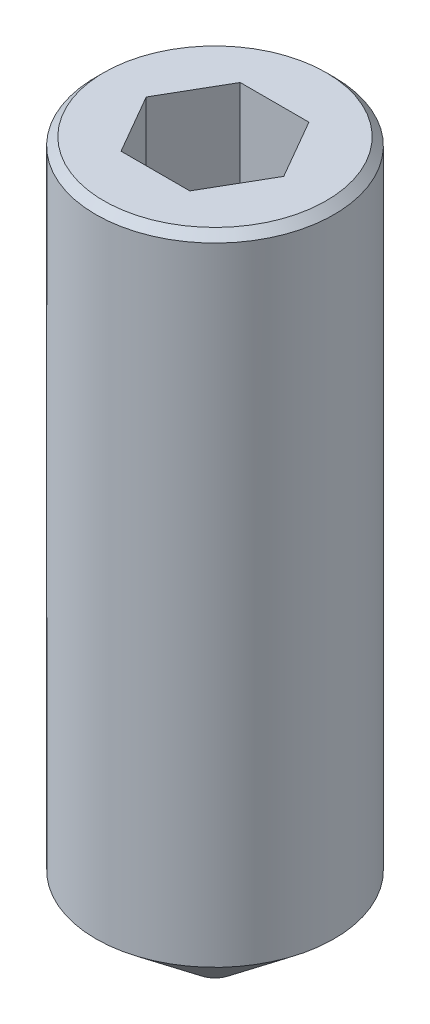
ISO-10303-21;
HEADER;
FILE_DESCRIPTION(('STEP AP214'),'2;1');
FILE_NAME('part.step','',(''),(''),'','','');
FILE_SCHEMA(('AUTOMOTIVE_DESIGN { 1 0 10303 214 1 1 1 1 }'));
ENDSEC;
DATA;
#1=APPLICATION_CONTEXT('core data for automotive mechanical design processes');
#2=APPLICATION_PROTOCOL_DEFINITION('international standard','automotive_design',2000,#1);
#3=PRODUCT_CONTEXT('',#1,'mechanical');
#4=PRODUCT('Part','Part','',(#3));
#5=PRODUCT_RELATED_PRODUCT_CATEGORY('part','',(#4));
#6=PRODUCT_DEFINITION_FORMATION('','',#4);
#7=PRODUCT_DEFINITION_CONTEXT('part definition',#1,'design');
#8=PRODUCT_DEFINITION('design','',#6,#7);
#9=PRODUCT_DEFINITION_SHAPE('','',#8);
#10=(LENGTH_UNIT() NAMED_UNIT(*) SI_UNIT(.MILLI.,.METRE.));
#11=(NAMED_UNIT(*) PLANE_ANGLE_UNIT() SI_UNIT($,.RADIAN.));
#12=(NAMED_UNIT(*) SI_UNIT($,.STERADIAN.) SOLID_ANGLE_UNIT());
#13=UNCERTAINTY_MEASURE_WITH_UNIT(LENGTH_MEASURE(1.E-05),#10,'distance_accuracy_value','');
#14=(GEOMETRIC_REPRESENTATION_CONTEXT(3) GLOBAL_UNCERTAINTY_ASSIGNED_CONTEXT((#13)) GLOBAL_UNIT_ASSIGNED_CONTEXT((#10,
#11,#12)) REPRESENTATION_CONTEXT('',''));
#15=CARTESIAN_POINT('',(0.,0.,0.));
#16=DIRECTION('',(0.,0.,1.));
#17=DIRECTION('',(1.,0.,0.));
#18=AXIS2_PLACEMENT_3D('',#15,#16,#17);
#19=CARTESIAN_POINT('',(0.,0.,0.));
#20=DIRECTION('',(0.,-1.,0.));
#21=DIRECTION('',(0.,0.,-1.));
#22=AXIS2_PLACEMENT_3D('',#19,#20,#21);
#23=PLANE('',#22);
#24=CARTESIAN_POINT('',(0.,0.,0.));
#25=DIRECTION('',(0.,-1.,0.));
#26=DIRECTION('',(0.,0.,-1.));
#27=AXIS2_PLACEMENT_3D('',#24,#25,#26);
#28=CIRCLE('',#27,1.4);
#29=CARTESIAN_POINT('',(0.,0.,-1.4));
#30=VERTEX_POINT('',#29);
#31=EDGE_CURVE('E43',#30,#30,#28,.F.);
#32=ORIENTED_EDGE('',*,*,#31,.T.);
#33=EDGE_LOOP('',(#32));
#34=FACE_BOUND('',#33,.T.);
#35=DIRECTION('',(1.,0.,0.));
#36=VECTOR('',#35,1.);
#37=CARTESIAN_POINT('',(-0.433012701892219,0.,0.75));
#38=LINE('',#37,#36);
#39=CARTESIAN_POINT('',(-0.433012701892219,0.,0.75));
#40=VERTEX_POINT('',#39);
#41=CARTESIAN_POINT('',(0.433012701892219,0.,0.75));
#42=VERTEX_POINT('',#41);
#43=EDGE_CURVE('E124',#40,#42,#38,.T.);
#44=ORIENTED_EDGE('',*,*,#43,.F.);
#45=DIRECTION('',(0.5,0.,0.866025403784438));
#46=VECTOR('',#45,1.);
#47=CARTESIAN_POINT('',(-0.866025403784439,0.,0.));
#48=LINE('',#47,#46);
#49=CARTESIAN_POINT('',(-0.866025403784439,0.,0.));
#50=VERTEX_POINT('',#49);
#51=EDGE_CURVE('E50',#50,#40,#48,.T.);
#52=ORIENTED_EDGE('',*,*,#51,.F.);
#53=DIRECTION('',(-0.5,0.,0.866025403784439));
#54=VECTOR('',#53,1.);
#55=CARTESIAN_POINT('',(-0.433012701892219,0.,-0.75));
#56=LINE('',#55,#54);
#57=CARTESIAN_POINT('',(-0.433012701892219,0.,-0.75));
#58=VERTEX_POINT('',#57);
#59=EDGE_CURVE('E133',#58,#50,#56,.T.);
#60=ORIENTED_EDGE('',*,*,#59,.F.);
#61=DIRECTION('',(-1.,0.,0.));
#62=VECTOR('',#61,1.);
#63=CARTESIAN_POINT('',(0.433012701892219,0.,-0.75));
#64=LINE('',#63,#62);
#65=CARTESIAN_POINT('',(0.433012701892219,0.,-0.75));
#66=VERTEX_POINT('',#65);
#67=EDGE_CURVE('E131',#66,#58,#64,.T.);
#68=ORIENTED_EDGE('',*,*,#67,.F.);
#69=DIRECTION('',(-0.5,0.,-0.866025403784439));
#70=VECTOR('',#69,1.);
#71=CARTESIAN_POINT('',(0.866025403784438,0.,0.));
#72=LINE('',#71,#70);
#73=CARTESIAN_POINT('',(0.866025403784438,0.,0.));
#74=VERTEX_POINT('',#73);
#75=EDGE_CURVE('E98',#74,#66,#72,.T.);
#76=ORIENTED_EDGE('',*,*,#75,.F.);
#77=DIRECTION('',(0.5,0.,-0.866025403784439));
#78=VECTOR('',#77,1.);
#79=CARTESIAN_POINT('',(0.433012701892219,0.,0.75));
#80=LINE('',#79,#78);
#81=EDGE_CURVE('E127',#42,#74,#80,.T.);
#82=ORIENTED_EDGE('',*,*,#81,.F.);
#83=EDGE_LOOP('',(#44,#52,#60,#68,#76,#82));
#84=FACE_BOUND('',#83,.T.);
#85=ADVANCED_FACE('F35',(#34,#84),#23,.F.);
#86=CARTESIAN_POINT('',(0.,8.71350028878554,0.));
#87=DIRECTION('',(0.,1.,0.));
#88=DIRECTION('',(0.,0.,1.));
#89=AXIS2_PLACEMENT_3D('',#86,#87,#88);
#90=CYLINDRICAL_SURFACE('',#89,1.5);
#91=CARTESIAN_POINT('',(0.,-0.0999999999999994,0.));
#92=DIRECTION('',(0.,-1.,0.));
#93=DIRECTION('',(0.,0.,-1.));
#94=AXIS2_PLACEMENT_3D('',#91,#92,#93);
#95=CIRCLE('',#94,1.5);
#96=CARTESIAN_POINT('',(0.,-0.0999999999999994,-1.5));
#97=VERTEX_POINT('',#96);
#98=EDGE_CURVE('E11',#97,#97,#95,.T.);
#99=ORIENTED_EDGE('',*,*,#98,.T.);
#100=EDGE_LOOP('',(#99));
#101=FACE_BOUND('',#100,.T.);
#102=CARTESIAN_POINT('',(0.,-8.,0.));
#103=DIRECTION('',(0.,1.,0.));
#104=DIRECTION('',(0.,0.,1.));
#105=AXIS2_PLACEMENT_3D('',#102,#103,#104);
#106=CIRCLE('',#105,1.5);
#107=CARTESIAN_POINT('',(0.,-8.,1.5));
#108=VERTEX_POINT('',#107);
#109=EDGE_CURVE('E145',#108,#108,#106,.T.);
#110=ORIENTED_EDGE('',*,*,#109,.T.);
#111=EDGE_LOOP('',(#110));
#112=FACE_BOUND('',#111,.T.);
#113=ADVANCED_FACE('F161',(#101,#112),#90,.T.);
#114=CARTESIAN_POINT('',(0.,-9.,0.));
#115=DIRECTION('',(0.,1.,0.));
#116=DIRECTION('',(0.,0.,1.));
#117=AXIS2_PLACEMENT_3D('',#114,#115,#116);
#118=CONICAL_SURFACE('',#117,0.250000000000002,0.896055384571344);
#119=CARTESIAN_POINT('',(0.,-9.,0.));
#120=DIRECTION('',(0.,1.,0.));
#121=DIRECTION('',(0.,0.,1.));
#122=AXIS2_PLACEMENT_3D('',#119,#120,#121);
#123=CIRCLE('',#122,0.250000000000002);
#124=CARTESIAN_POINT('',(0.,-9.,0.250000000000001));
#125=VERTEX_POINT('',#124);
#126=EDGE_CURVE('E137',#125,#125,#123,.T.);
#127=CARTESIAN_POINT('',(0.,-8.,1.5));
#128=CARTESIAN_POINT('',(0.,-8.01041666666667,1.48697916666667));
#129=CARTESIAN_POINT('',(0.,-8.02083333333333,1.47395833333333));
#130=CARTESIAN_POINT('',(0.,-8.04166666666667,1.44791666666667));
#131=CARTESIAN_POINT('',(0.,-8.05208333333333,1.43489583333333));
#132=CARTESIAN_POINT('',(0.,-8.07291666666667,1.40885416666667));
#133=CARTESIAN_POINT('',(0.,-8.08333333333333,1.39583333333333));
#134=CARTESIAN_POINT('',(0.,-8.10416666666667,1.36979166666667));
#135=CARTESIAN_POINT('',(0.,-8.11458333333333,1.35677083333333));
#136=CARTESIAN_POINT('',(0.,-8.13541666666667,1.33072916666667));
#137=CARTESIAN_POINT('',(0.,-8.14583333333333,1.31770833333333));
#138=CARTESIAN_POINT('',(0.,-8.16666666666667,1.29166666666667));
#139=CARTESIAN_POINT('',(0.,-8.17708333333333,1.27864583333333));
#140=CARTESIAN_POINT('',(0.,-8.19791666666667,1.25260416666667));
#141=CARTESIAN_POINT('',(0.,-8.20833333333333,1.23958333333333));
#142=CARTESIAN_POINT('',(0.,-8.22916666666667,1.21354166666667));
#143=CARTESIAN_POINT('',(0.,-8.23958333333333,1.20052083333333));
#144=CARTESIAN_POINT('',(0.,-8.26041666666667,1.17447916666667));
#145=CARTESIAN_POINT('',(0.,-8.27083333333333,1.16145833333333));
#146=CARTESIAN_POINT('',(0.,-8.29166666666667,1.13541666666667));
#147=CARTESIAN_POINT('',(0.,-8.30208333333333,1.12239583333333));
#148=CARTESIAN_POINT('',(0.,-8.32291666666667,1.09635416666667));
#149=CARTESIAN_POINT('',(0.,-8.33333333333333,1.08333333333333));
#150=CARTESIAN_POINT('',(0.,-8.35416666666667,1.05729166666667));
#151=CARTESIAN_POINT('',(0.,-8.36458333333333,1.04427083333333));
#152=CARTESIAN_POINT('',(0.,-8.38541666666667,1.01822916666667));
#153=CARTESIAN_POINT('',(0.,-8.39583333333333,1.00520833333333));
#154=CARTESIAN_POINT('',(0.,-8.41666666666667,0.979166666666668));
#155=CARTESIAN_POINT('',(0.,-8.42708333333333,0.966145833333335));
#156=CARTESIAN_POINT('',(0.,-8.44791666666667,0.940104166666668));
#157=CARTESIAN_POINT('',(0.,-8.45833333333333,0.927083333333335));
#158=CARTESIAN_POINT('',(0.,-8.47916666666667,0.901041666666668));
#159=CARTESIAN_POINT('',(0.,-8.48958333333333,0.888020833333334));
#160=CARTESIAN_POINT('',(0.,-8.51041666666667,0.861979166666668));
#161=CARTESIAN_POINT('',(0.,-8.52083333333333,0.848958333333334));
#162=CARTESIAN_POINT('',(0.,-8.54166666666667,0.822916666666668));
#163=CARTESIAN_POINT('',(0.,-8.55208333333333,0.809895833333334));
#164=CARTESIAN_POINT('',(0.,-8.57291666666667,0.783854166666668));
#165=CARTESIAN_POINT('',(0.,-8.58333333333333,0.770833333333334));
#166=CARTESIAN_POINT('',(0.,-8.60416666666667,0.744791666666668));
#167=CARTESIAN_POINT('',(0.,-8.61458333333333,0.731770833333334));
#168=CARTESIAN_POINT('',(0.,-8.63541666666667,0.705729166666668));
#169=CARTESIAN_POINT('',(0.,-8.64583333333333,0.692708333333334));
#170=CARTESIAN_POINT('',(0.,-8.66666666666667,0.666666666666668));
#171=CARTESIAN_POINT('',(0.,-8.67708333333333,0.653645833333334));
#172=CARTESIAN_POINT('',(0.,-8.69791666666667,0.627604166666668));
#173=CARTESIAN_POINT('',(0.,-8.70833333333333,0.614583333333334));
#174=CARTESIAN_POINT('',(0.,-8.72916666666667,0.588541666666668));
#175=CARTESIAN_POINT('',(0.,-8.73958333333333,0.575520833333334));
#176=CARTESIAN_POINT('',(0.,-8.76041666666667,0.549479166666668));
#177=CARTESIAN_POINT('',(0.,-8.77083333333333,0.536458333333334));
#178=CARTESIAN_POINT('',(0.,-8.79166666666667,0.510416666666668));
#179=CARTESIAN_POINT('',(0.,-8.80208333333333,0.497395833333334));
#180=CARTESIAN_POINT('',(0.,-8.82291666666667,0.471354166666668));
#181=CARTESIAN_POINT('',(0.,-8.83333333333333,0.458333333333334));
#182=CARTESIAN_POINT('',(0.,-8.85416666666667,0.432291666666668));
#183=CARTESIAN_POINT('',(0.,-8.86458333333333,0.419270833333334));
#184=CARTESIAN_POINT('',(0.,-8.88541666666667,0.393229166666668));
#185=CARTESIAN_POINT('',(0.,-8.89583333333333,0.380208333333334));
#186=CARTESIAN_POINT('',(0.,-8.91666666666667,0.354166666666668));
#187=CARTESIAN_POINT('',(0.,-8.92708333333333,0.341145833333334));
#188=CARTESIAN_POINT('',(0.,-8.94791666666667,0.315104166666668));
#189=CARTESIAN_POINT('',(0.,-8.95833333333333,0.302083333333334));
#190=CARTESIAN_POINT('',(0.,-8.97916666666667,0.276041666666668));
#191=CARTESIAN_POINT('',(0.,-8.98958333333333,0.263020833333334));
#192=CARTESIAN_POINT('',(0.,-9.,0.250000000000001));
#193=B_SPLINE_CURVE_WITH_KNOTS('',3,(#127,#128,#129,#130,#131,#132,#133,#134,#135,#136,#137,
#138,#139,#140,#141,#142,#143,#144,#145,#146,#147,#148,#149,#150,#151,#152,#153,#154,#155,#156,
#157,#158,#159,#160,#161,#162,#163,#164,#165,#166,#167,#168,#169,#170,#171,#172,#173,#174,#175,
#176,#177,#178,#179,#180,#181,#182,#183,#184,#185,#186,#187,#188,#189,#190,#191,#192),
.UNSPECIFIED.,.F.,.F.,(4,2,2,2,2,2,2,2,2,2,2,2,2,2,2,2,2,2,2,2,2,2,2,2,2,2,2,2,2,2,2,2,4),(0.,
0.0500244081049442,0.100048816209888,0.150073224314833,0.200097632419777,0.250122040524721,
0.300146448629665,0.350170856734609,0.400195264839553,0.450219672944497,0.500244081049442,
0.550268489154386,0.60029289725933,0.650317305364274,0.700341713469218,0.750366121574162,
0.800390529679107,0.850414937784051,0.900439345888995,0.950463753993939,1.00048816209888,
1.05051257020383,1.10053697830877,1.15056138641372,1.20058579451866,1.2506102026236,
1.30063461072855,1.35065901883349,1.40068342693844,1.45070783504338,1.50073224314833,
1.55075665125327,1.60078105935821),.UNSPECIFIED.);
#194=EDGE_CURVE('BSEAM165',#108,#125,#193,.T.);
#195=ORIENTED_EDGE('',*,*,#109,.F.);
#196=ORIENTED_EDGE('',*,*,#126,.T.);
#197=ORIENTED_EDGE('',*,*,#194,.T.);
#198=ORIENTED_EDGE('',*,*,#194,.F.);
#199=EDGE_LOOP('',(#195,#197,#196,#198));
#200=FACE_BOUND('',#199,.T.);
#201=ADVANCED_FACE('F165',(#200),#118,.T.);
#202=CARTESIAN_POINT('',(0.250000000000002,-9.,0.));
#203=DIRECTION('',(0.,1.,0.));
#204=DIRECTION('',(0.,0.,1.));
#205=AXIS2_PLACEMENT_3D('',#202,#203,#204);
#206=PLANE('',#205);
#207=ORIENTED_EDGE('',*,*,#126,.F.);
#208=EDGE_LOOP('',(#207));
#209=FACE_BOUND('',#208,.T.);
#210=ADVANCED_FACE('F171',(#209),#206,.F.);
#211=CARTESIAN_POINT('',(-0.866025403784439,-1.5,0.));
#212=DIRECTION('',(-0.866025403784438,0.,0.5));
#213=DIRECTION('',(0.5,0.,0.866025403784438));
#214=AXIS2_PLACEMENT_3D('',#211,#212,#213);
#215=PLANE('',#214);
#216=ORIENTED_EDGE('',*,*,#51,.T.);
#217=DIRECTION('',(0.,1.,0.));
#218=VECTOR('',#217,1.);
#219=CARTESIAN_POINT('',(-0.433012701892219,-1.5,0.75));
#220=LINE('',#219,#218);
#221=CARTESIAN_POINT('',(-0.433012701892219,-1.5,0.75));
#222=VERTEX_POINT('',#221);
#223=EDGE_CURVE('E80',#222,#40,#220,.T.);
#224=ORIENTED_EDGE('',*,*,#223,.F.);
#225=DIRECTION('',(0.5,0.,0.866025403784438));
#226=VECTOR('',#225,1.);
#227=CARTESIAN_POINT('',(-0.866025403784439,-1.5,0.));
#228=LINE('',#227,#226);
#229=CARTESIAN_POINT('',(-0.866025403784439,-1.5,0.));
#230=VERTEX_POINT('',#229);
#231=EDGE_CURVE('E135',#230,#222,#228,.T.);
#232=ORIENTED_EDGE('',*,*,#231,.F.);
#233=DIRECTION('',(0.,1.,0.));
#234=VECTOR('',#233,1.);
#235=CARTESIAN_POINT('',(-0.866025403784439,-1.5,0.));
#236=LINE('',#235,#234);
#237=EDGE_CURVE('E58',#230,#50,#236,.T.);
#238=ORIENTED_EDGE('',*,*,#237,.T.);
#239=EDGE_LOOP('',(#216,#224,#232,#238));
#240=FACE_BOUND('',#239,.T.);
#241=ADVANCED_FACE('F175',(#240),#215,.F.);
#242=CARTESIAN_POINT('',(-0.433012701892219,-1.5,-0.75));
#243=DIRECTION('',(-0.866025403784439,0.,-0.5));
#244=DIRECTION('',(-0.5,0.,0.866025403784439));
#245=AXIS2_PLACEMENT_3D('',#242,#243,#244);
#246=PLANE('',#245);
#247=ORIENTED_EDGE('',*,*,#59,.T.);
#248=ORIENTED_EDGE('',*,*,#237,.F.);
#249=DIRECTION('',(-0.5,0.,0.866025403784439));
#250=VECTOR('',#249,1.);
#251=CARTESIAN_POINT('',(-0.433012701892219,-1.5,-0.75));
#252=LINE('',#251,#250);
#253=CARTESIAN_POINT('',(-0.433012701892219,-1.5,-0.75));
#254=VERTEX_POINT('',#253);
#255=EDGE_CURVE('E110',#254,#230,#252,.T.);
#256=ORIENTED_EDGE('',*,*,#255,.F.);
#257=DIRECTION('',(0.,1.,0.));
#258=VECTOR('',#257,1.);
#259=CARTESIAN_POINT('',(-0.433012701892219,-1.5,-0.75));
#260=LINE('',#259,#258);
#261=EDGE_CURVE('E102',#254,#58,#260,.T.);
#262=ORIENTED_EDGE('',*,*,#261,.T.);
#263=EDGE_LOOP('',(#247,#248,#256,#262));
#264=FACE_BOUND('',#263,.T.);
#265=ADVANCED_FACE('F179',(#264),#246,.F.);
#266=CARTESIAN_POINT('',(0.433012701892219,-1.5,-0.75));
#267=DIRECTION('',(0.,0.,-1.));
#268=DIRECTION('',(-1.,0.,0.));
#269=AXIS2_PLACEMENT_3D('',#266,#267,#268);
#270=PLANE('',#269);
#271=ORIENTED_EDGE('',*,*,#67,.T.);
#272=ORIENTED_EDGE('',*,*,#261,.F.);
#273=DIRECTION('',(-1.,0.,0.));
#274=VECTOR('',#273,1.);
#275=CARTESIAN_POINT('',(0.433012701892219,-1.5,-0.75));
#276=LINE('',#275,#274);
#277=CARTESIAN_POINT('',(0.433012701892219,-1.5,-0.75));
#278=VERTEX_POINT('',#277);
#279=EDGE_CURVE('E106',#278,#254,#276,.T.);
#280=ORIENTED_EDGE('',*,*,#279,.F.);
#281=DIRECTION('',(0.,1.,0.));
#282=VECTOR('',#281,1.);
#283=CARTESIAN_POINT('',(0.433012701892219,-1.5,-0.75));
#284=LINE('',#283,#282);
#285=EDGE_CURVE('E91',#278,#66,#284,.T.);
#286=ORIENTED_EDGE('',*,*,#285,.T.);
#287=EDGE_LOOP('',(#271,#272,#280,#286));
#288=FACE_BOUND('',#287,.T.);
#289=ADVANCED_FACE('F107',(#288),#270,.F.);
#290=CARTESIAN_POINT('',(0.866025403784438,-1.5,0.));
#291=DIRECTION('',(0.866025403784438,0.,-0.5));
#292=DIRECTION('',(-0.5,0.,-0.866025403784439));
#293=AXIS2_PLACEMENT_3D('',#290,#291,#292);
#294=PLANE('',#293);
#295=ORIENTED_EDGE('',*,*,#75,.T.);
#296=ORIENTED_EDGE('',*,*,#285,.F.);
#297=DIRECTION('',(-0.5,0.,-0.866025403784439));
#298=VECTOR('',#297,1.);
#299=CARTESIAN_POINT('',(0.866025403784438,-1.5,0.));
#300=LINE('',#299,#298);
#301=CARTESIAN_POINT('',(0.866025403784438,-1.5,0.));
#302=VERTEX_POINT('',#301);
#303=EDGE_CURVE('E95',#302,#278,#300,.T.);
#304=ORIENTED_EDGE('',*,*,#303,.F.);
#305=DIRECTION('',(0.,1.,0.));
#306=VECTOR('',#305,1.);
#307=CARTESIAN_POINT('',(0.866025403784438,-1.5,0.));
#308=LINE('',#307,#306);
#309=EDGE_CURVE('E103',#302,#74,#308,.T.);
#310=ORIENTED_EDGE('',*,*,#309,.T.);
#311=EDGE_LOOP('',(#295,#296,#304,#310));
#312=FACE_BOUND('',#311,.T.);
#313=ADVANCED_FACE('F93',(#312),#294,.F.);
#314=CARTESIAN_POINT('',(0.433012701892219,-1.5,0.75));
#315=DIRECTION('',(0.866025403784439,0.,0.5));
#316=DIRECTION('',(0.5,0.,-0.866025403784439));
#317=AXIS2_PLACEMENT_3D('',#314,#315,#316);
#318=PLANE('',#317);
#319=ORIENTED_EDGE('',*,*,#81,.T.);
#320=ORIENTED_EDGE('',*,*,#309,.F.);
#321=DIRECTION('',(0.5,0.,-0.866025403784439));
#322=VECTOR('',#321,1.);
#323=CARTESIAN_POINT('',(0.433012701892219,-1.5,0.75));
#324=LINE('',#323,#322);
#325=CARTESIAN_POINT('',(0.433012701892219,-1.5,0.75));
#326=VERTEX_POINT('',#325);
#327=EDGE_CURVE('E116',#326,#302,#324,.T.);
#328=ORIENTED_EDGE('',*,*,#327,.F.);
#329=DIRECTION('',(0.,1.,0.));
#330=VECTOR('',#329,1.);
#331=CARTESIAN_POINT('',(0.433012701892219,-1.5,0.75));
#332=LINE('',#331,#330);
#333=EDGE_CURVE('E140',#326,#42,#332,.T.);
#334=ORIENTED_EDGE('',*,*,#333,.T.);
#335=EDGE_LOOP('',(#319,#320,#328,#334));
#336=FACE_BOUND('',#335,.T.);
#337=ADVANCED_FACE('F182',(#336),#318,.F.);
#338=CARTESIAN_POINT('',(-0.433012701892219,-1.5,0.75));
#339=DIRECTION('',(0.,0.,1.));
#340=DIRECTION('',(1.,0.,0.));
#341=AXIS2_PLACEMENT_3D('',#338,#339,#340);
#342=PLANE('',#341);
#343=ORIENTED_EDGE('',*,*,#43,.T.);
#344=ORIENTED_EDGE('',*,*,#333,.F.);
#345=DIRECTION('',(1.,0.,0.));
#346=VECTOR('',#345,1.);
#347=CARTESIAN_POINT('',(-0.433012701892219,-1.5,0.75));
#348=LINE('',#347,#346);
#349=EDGE_CURVE('E118',#222,#326,#348,.T.);
#350=ORIENTED_EDGE('',*,*,#349,.F.);
#351=ORIENTED_EDGE('',*,*,#223,.T.);
#352=EDGE_LOOP('',(#343,#344,#350,#351));
#353=FACE_BOUND('',#352,.T.);
#354=ADVANCED_FACE('F157',(#353),#342,.F.);
#355=CARTESIAN_POINT('',(0.,-1.5,0.));
#356=DIRECTION('',(0.,1.,0.));
#357=DIRECTION('',(0.,0.,1.));
#358=AXIS2_PLACEMENT_3D('',#355,#356,#357);
#359=PLANE('',#358);
#360=ORIENTED_EDGE('',*,*,#231,.T.);
#361=ORIENTED_EDGE('',*,*,#349,.T.);
#362=ORIENTED_EDGE('',*,*,#327,.T.);
#363=ORIENTED_EDGE('',*,*,#303,.T.);
#364=ORIENTED_EDGE('',*,*,#279,.T.);
#365=ORIENTED_EDGE('',*,*,#255,.T.);
#366=EDGE_LOOP('',(#360,#361,#362,#363,#364,#365));
#367=FACE_BOUND('',#366,.T.);
#368=ADVANCED_FACE('F113',(#367),#359,.T.);
#369=CARTESIAN_POINT('',(0.,0.,0.));
#370=DIRECTION('',(0.,-1.,0.));
#371=DIRECTION('',(0.,0.,-1.));
#372=AXIS2_PLACEMENT_3D('',#369,#370,#371);
#373=CONICAL_SURFACE('',#372,1.4,0.785398163397456);
#374=ORIENTED_EDGE('',*,*,#98,.F.);
#375=EDGE_LOOP('',(#374));
#376=FACE_BOUND('',#375,.T.);
#377=ORIENTED_EDGE('',*,*,#31,.F.);
#378=EDGE_LOOP('',(#377));
#379=FACE_BOUND('',#378,.T.);
#380=ADVANCED_FACE('F37',(#376,#379),#373,.T.);
#381=CLOSED_SHELL('',(#85,#113,#201,#210,#241,#265,#289,#313,#337,#354,#368,#380));
#382=MANIFOLD_SOLID_BREP('B2',#381);
#383=ADVANCED_BREP_SHAPE_REPRESENTATION('',(#18,#382),#14);
#384=SHAPE_DEFINITION_REPRESENTATION(#9,#383);
ENDSEC;
END-ISO-10303-21;
